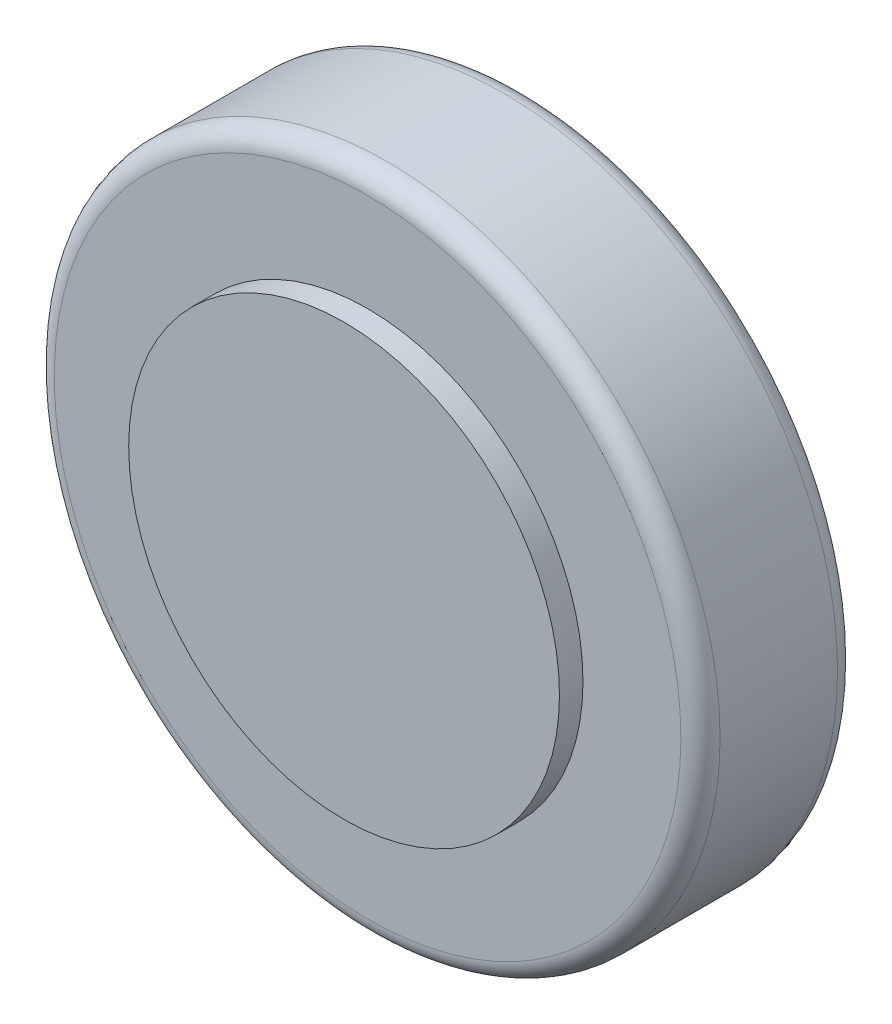
ISO-10303-21;
HEADER;
FILE_DESCRIPTION(('STEP AP214'),'2;1');
FILE_NAME('part.step','',(''),(''),'','','');
FILE_SCHEMA(('AUTOMOTIVE_DESIGN { 1 0 10303 214 1 1 1 1 }'));
ENDSEC;
DATA;
#1=APPLICATION_CONTEXT('core data for automotive mechanical design processes');
#2=APPLICATION_PROTOCOL_DEFINITION('international standard','automotive_design',2000,#1);
#3=PRODUCT_CONTEXT('',#1,'mechanical');
#4=PRODUCT('Part','Part','',(#3));
#5=PRODUCT_RELATED_PRODUCT_CATEGORY('part','',(#4));
#6=PRODUCT_DEFINITION_FORMATION('','',#4);
#7=PRODUCT_DEFINITION_CONTEXT('part definition',#1,'design');
#8=PRODUCT_DEFINITION('design','',#6,#7);
#9=PRODUCT_DEFINITION_SHAPE('','',#8);
#10=(LENGTH_UNIT() NAMED_UNIT(*) SI_UNIT(.MILLI.,.METRE.));
#11=(NAMED_UNIT(*) PLANE_ANGLE_UNIT() SI_UNIT($,.RADIAN.));
#12=(NAMED_UNIT(*) SI_UNIT($,.STERADIAN.) SOLID_ANGLE_UNIT());
#13=UNCERTAINTY_MEASURE_WITH_UNIT(LENGTH_MEASURE(1.E-05),#10,'distance_accuracy_value','');
#14=(GEOMETRIC_REPRESENTATION_CONTEXT(3) GLOBAL_UNCERTAINTY_ASSIGNED_CONTEXT((#13)) GLOBAL_UNIT_ASSIGNED_CONTEXT((#10,
#11,#12)) REPRESENTATION_CONTEXT('',''));
#15=CARTESIAN_POINT('',(0.,0.,0.));
#16=DIRECTION('',(0.,0.,1.));
#17=DIRECTION('',(1.,0.,0.));
#18=AXIS2_PLACEMENT_3D('',#15,#16,#17);
#19=CARTESIAN_POINT('',(-1.11022302462516E-13,0.,-15.000000000001));
#20=DIRECTION('',(0.,0.,1.));
#21=DIRECTION('',(1.,0.,0.));
#22=AXIS2_PLACEMENT_3D('',#19,#20,#21);
#23=TOROIDAL_SURFACE('',#22,80.0000000000002,4.99999999999999);
#24=CARTESIAN_POINT('',(-1.14498680058955E-13,0.,-15.0000000000011));
#25=DIRECTION('',(0.,0.,1.));
#26=DIRECTION('',(1.,0.,0.));
#27=AXIS2_PLACEMENT_3D('',#24,#25,#26);
#28=CIRCLE('',#27,85.0000000000002);
#29=CARTESIAN_POINT('',(85.0000000000001,0.,-15.));
#30=VERTEX_POINT('',#29);
#31=EDGE_CURVE('E73',#30,#30,#28,.T.);
#32=ORIENTED_EDGE('',*,*,#31,.F.);
#33=EDGE_LOOP('',(#32));
#34=FACE_BOUND('',#33,.T.);
#35=CARTESIAN_POINT('',(0.,0.,-20.000000000001));
#36=DIRECTION('',(0.,0.,1.));
#37=DIRECTION('',(1.,0.,0.));
#38=AXIS2_PLACEMENT_3D('',#35,#36,#37);
#39=CIRCLE('',#38,80.0000000000001);
#40=CARTESIAN_POINT('',(80.0000000000001,0.,-20.));
#41=VERTEX_POINT('',#40);
#42=EDGE_CURVE('E10',#41,#41,#39,.T.);
#43=ORIENTED_EDGE('',*,*,#42,.T.);
#44=EDGE_LOOP('',(#43));
#45=FACE_BOUND('',#44,.T.);
#46=ADVANCED_FACE('F39',(#34,#45),#23,.T.);
#47=CARTESIAN_POINT('',(0.,0.,-20.0000000000009));
#48=DIRECTION('',(0.,0.,1.));
#49=DIRECTION('',(1.,0.,0.));
#50=AXIS2_PLACEMENT_3D('',#47,#48,#49);
#51=PLANE('',#50);
#52=ORIENTED_EDGE('',*,*,#42,.F.);
#53=EDGE_LOOP('',(#52));
#54=FACE_BOUND('',#53,.T.);
#55=CARTESIAN_POINT('',(0.,0.,-20.0000000000007));
#56=DIRECTION('',(0.,0.,1.));
#57=DIRECTION('',(1.,0.,0.));
#58=AXIS2_PLACEMENT_3D('',#55,#56,#57);
#59=CIRCLE('',#58,55.0000000000001);
#60=CARTESIAN_POINT('',(55.0000000000001,0.,-20.));
#61=VERTEX_POINT('',#60);
#62=EDGE_CURVE('E45',#61,#61,#59,.T.);
#63=ORIENTED_EDGE('',*,*,#62,.T.);
#64=EDGE_LOOP('',(#63));
#65=FACE_BOUND('',#64,.T.);
#66=ADVANCED_FACE('F80',(#54,#65),#51,.F.);
#67=CARTESIAN_POINT('',(0.,0.,-26.));
#68=DIRECTION('',(0.,0.,1.));
#69=DIRECTION('',(1.,0.,0.));
#70=AXIS2_PLACEMENT_3D('',#67,#68,#69);
#71=CYLINDRICAL_SURFACE('',#70,55.0000000000001);
#72=CARTESIAN_POINT('',(0.,0.,-26.0000000000007));
#73=DIRECTION('',(0.,0.,1.));
#74=DIRECTION('',(1.,0.,0.));
#75=AXIS2_PLACEMENT_3D('',#72,#73,#74);
#76=CIRCLE('',#75,55.);
#77=CARTESIAN_POINT('',(55.0000000000001,0.,-26.));
#78=VERTEX_POINT('',#77);
#79=EDGE_CURVE('E49',#78,#78,#76,.T.);
#80=ORIENTED_EDGE('',*,*,#79,.T.);
#81=EDGE_LOOP('',(#80));
#82=FACE_BOUND('',#81,.T.);
#83=ORIENTED_EDGE('',*,*,#62,.F.);
#84=EDGE_LOOP('',(#83));
#85=FACE_BOUND('',#84,.T.);
#86=ADVANCED_FACE('F84',(#82,#85),#71,.T.);
#87=CARTESIAN_POINT('',(0.,0.,-26.0000000000004));
#88=DIRECTION('',(0.,0.,1.));
#89=DIRECTION('',(1.,0.,0.));
#90=AXIS2_PLACEMENT_3D('',#87,#88,#89);
#91=PLANE('',#90);
#92=ORIENTED_EDGE('',*,*,#79,.F.);
#93=EDGE_LOOP('',(#92));
#94=FACE_BOUND('',#93,.T.);
#95=CARTESIAN_POINT('',(0.,0.,-26.0000000000001));
#96=DIRECTION('',(0.,0.,1.));
#97=DIRECTION('',(1.,0.,0.));
#98=AXIS2_PLACEMENT_3D('',#95,#96,#97);
#99=CIRCLE('',#98,5.00000000000006);
#100=CARTESIAN_POINT('',(5.00000000000008,0.,-26.));
#101=VERTEX_POINT('',#100);
#102=EDGE_CURVE('E53',#101,#101,#99,.T.);
#103=ORIENTED_EDGE('',*,*,#102,.T.);
#104=EDGE_LOOP('',(#103));
#105=FACE_BOUND('',#104,.T.);
#106=ADVANCED_FACE('F89',(#94,#105),#91,.F.);
#107=CARTESIAN_POINT('',(0.,0.,-26.));
#108=DIRECTION('',(0.,0.,1.));
#109=DIRECTION('',(1.,0.,0.));
#110=AXIS2_PLACEMENT_3D('',#107,#108,#109);
#111=CYLINDRICAL_SURFACE('',#110,5.00000000000002);
#112=CARTESIAN_POINT('',(0.,0.,-31.0000000000001));
#113=DIRECTION('',(0.,0.,1.));
#114=DIRECTION('',(1.,0.,0.));
#115=AXIS2_PLACEMENT_3D('',#112,#113,#114);
#116=CIRCLE('',#115,4.99999999999999);
#117=CARTESIAN_POINT('',(5.00000000000008,0.,-31.));
#118=VERTEX_POINT('',#117);
#119=EDGE_CURVE('E58',#118,#118,#116,.T.);
#120=ORIENTED_EDGE('',*,*,#119,.T.);
#121=EDGE_LOOP('',(#120));
#122=FACE_BOUND('',#121,.T.);
#123=ORIENTED_EDGE('',*,*,#102,.F.);
#124=EDGE_LOOP('',(#123));
#125=FACE_BOUND('',#124,.T.);
#126=ADVANCED_FACE('F95',(#122,#125),#111,.T.);
#127=CARTESIAN_POINT('',(0.,0.,-31.));
#128=DIRECTION('',(0.,0.,1.));
#129=DIRECTION('',(1.,0.,0.));
#130=AXIS2_PLACEMENT_3D('',#127,#128,#129);
#131=PLANE('',#130);
#132=ORIENTED_EDGE('',*,*,#119,.F.);
#133=EDGE_LOOP('',(#132));
#134=FACE_BOUND('',#133,.T.);
#135=ADVANCED_FACE('F99',(#134),#131,.F.);
#136=CARTESIAN_POINT('',(0.,0.,25.9999999999996));
#137=DIRECTION('',(0.,0.,1.));
#138=DIRECTION('',(1.,0.,0.));
#139=AXIS2_PLACEMENT_3D('',#136,#137,#138);
#140=PLANE('',#139);
#141=CARTESIAN_POINT('',(-6.36688075215391E-13,0.,25.9999999999993));
#142=DIRECTION('',(0.,0.,1.));
#143=DIRECTION('',(1.,0.,0.));
#144=AXIS2_PLACEMENT_3D('',#141,#142,#143);
#145=CIRCLE('',#144,55.0000000000007);
#146=CARTESIAN_POINT('',(55.0000000000001,0.,26.));
#147=VERTEX_POINT('',#146);
#148=EDGE_CURVE('E61',#147,#147,#145,.T.);
#149=ORIENTED_EDGE('',*,*,#148,.T.);
#150=EDGE_LOOP('',(#149));
#151=FACE_BOUND('',#150,.T.);
#152=ADVANCED_FACE('F103',(#151),#140,.T.);
#153=CARTESIAN_POINT('',(0.,0.,-26.));
#154=DIRECTION('',(0.,0.,1.));
#155=DIRECTION('',(1.,0.,0.));
#156=AXIS2_PLACEMENT_3D('',#153,#154,#155);
#157=CYLINDRICAL_SURFACE('',#156,55.0000000000007);
#158=ORIENTED_EDGE('',*,*,#148,.F.);
#159=EDGE_LOOP('',(#158));
#160=FACE_BOUND('',#159,.T.);
#161=CARTESIAN_POINT('',(-5.60270114948596E-13,0.,19.9999999999993));
#162=DIRECTION('',(0.,0.,1.));
#163=DIRECTION('',(1.,0.,0.));
#164=AXIS2_PLACEMENT_3D('',#161,#162,#163);
#165=CIRCLE('',#164,55.0000000000006);
#166=CARTESIAN_POINT('',(55.0000000000001,0.,20.));
#167=VERTEX_POINT('',#166);
#168=EDGE_CURVE('E64',#167,#167,#165,.T.);
#169=ORIENTED_EDGE('',*,*,#168,.T.);
#170=EDGE_LOOP('',(#169));
#171=FACE_BOUND('',#170,.T.);
#172=ADVANCED_FACE('F107',(#160,#171),#157,.T.);
#173=CARTESIAN_POINT('',(0.,0.,19.9999999999991));
#174=DIRECTION('',(0.,0.,1.));
#175=DIRECTION('',(1.,0.,0.));
#176=AXIS2_PLACEMENT_3D('',#173,#174,#175);
#177=PLANE('',#176);
#178=CARTESIAN_POINT('',(-5.60270114948592E-13,0.,19.999999999999));
#179=DIRECTION('',(0.,0.,1.));
#180=DIRECTION('',(1.,0.,0.));
#181=AXIS2_PLACEMENT_3D('',#178,#179,#180);
#182=CIRCLE('',#181,80.0000000000006);
#183=CARTESIAN_POINT('',(80.0000000000001,0.,20.));
#184=VERTEX_POINT('',#183);
#185=EDGE_CURVE('E67',#184,#184,#182,.T.);
#186=ORIENTED_EDGE('',*,*,#185,.T.);
#187=EDGE_LOOP('',(#186));
#188=FACE_BOUND('',#187,.T.);
#189=ORIENTED_EDGE('',*,*,#168,.F.);
#190=EDGE_LOOP('',(#189));
#191=FACE_BOUND('',#190,.T.);
#192=ADVANCED_FACE('F111',(#188,#191),#177,.T.);
#193=CARTESIAN_POINT('',(-4.9960036108132E-13,0.,14.999999999999));
#194=DIRECTION('',(0.,0.,1.));
#195=DIRECTION('',(1.,0.,0.));
#196=AXIS2_PLACEMENT_3D('',#193,#194,#195);
#197=TOROIDAL_SURFACE('',#196,80.0000000000006,5.);
#198=CARTESIAN_POINT('',(-4.96588481392929E-13,0.,14.9999999999989));
#199=DIRECTION('',(0.,0.,1.));
#200=DIRECTION('',(1.,0.,0.));
#201=AXIS2_PLACEMENT_3D('',#198,#199,#200);
#202=CIRCLE('',#201,85.0000000000006);
#203=CARTESIAN_POINT('',(85.0000000000001,0.,15.));
#204=VERTEX_POINT('',#203);
#205=EDGE_CURVE('E70',#204,#204,#202,.T.);
#206=ORIENTED_EDGE('',*,*,#205,.T.);
#207=EDGE_LOOP('',(#206));
#208=FACE_BOUND('',#207,.T.);
#209=ORIENTED_EDGE('',*,*,#185,.F.);
#210=EDGE_LOOP('',(#209));
#211=FACE_BOUND('',#210,.T.);
#212=ADVANCED_FACE('F115',(#208,#211),#197,.T.);
#213=CARTESIAN_POINT('',(0.,0.,-26.));
#214=DIRECTION('',(0.,0.,1.));
#215=DIRECTION('',(1.,0.,0.));
#216=AXIS2_PLACEMENT_3D('',#213,#214,#215);
#217=CYLINDRICAL_SURFACE('',#216,85.0000000000004);
#218=ORIENTED_EDGE('',*,*,#205,.F.);
#219=EDGE_LOOP('',(#218));
#220=FACE_BOUND('',#219,.T.);
#221=ORIENTED_EDGE('',*,*,#31,.T.);
#222=EDGE_LOOP('',(#221));
#223=FACE_BOUND('',#222,.T.);
#224=ADVANCED_FACE('F77',(#220,#223),#217,.T.);
#225=CLOSED_SHELL('',(#46,#66,#86,#106,#126,#135,#152,#172,#192,#212,#224));
#226=MANIFOLD_SOLID_BREP('B2',#225);
#227=ADVANCED_BREP_SHAPE_REPRESENTATION('',(#18,#226),#14);
#228=SHAPE_DEFINITION_REPRESENTATION(#9,#227);
ENDSEC;
END-ISO-10303-21;
